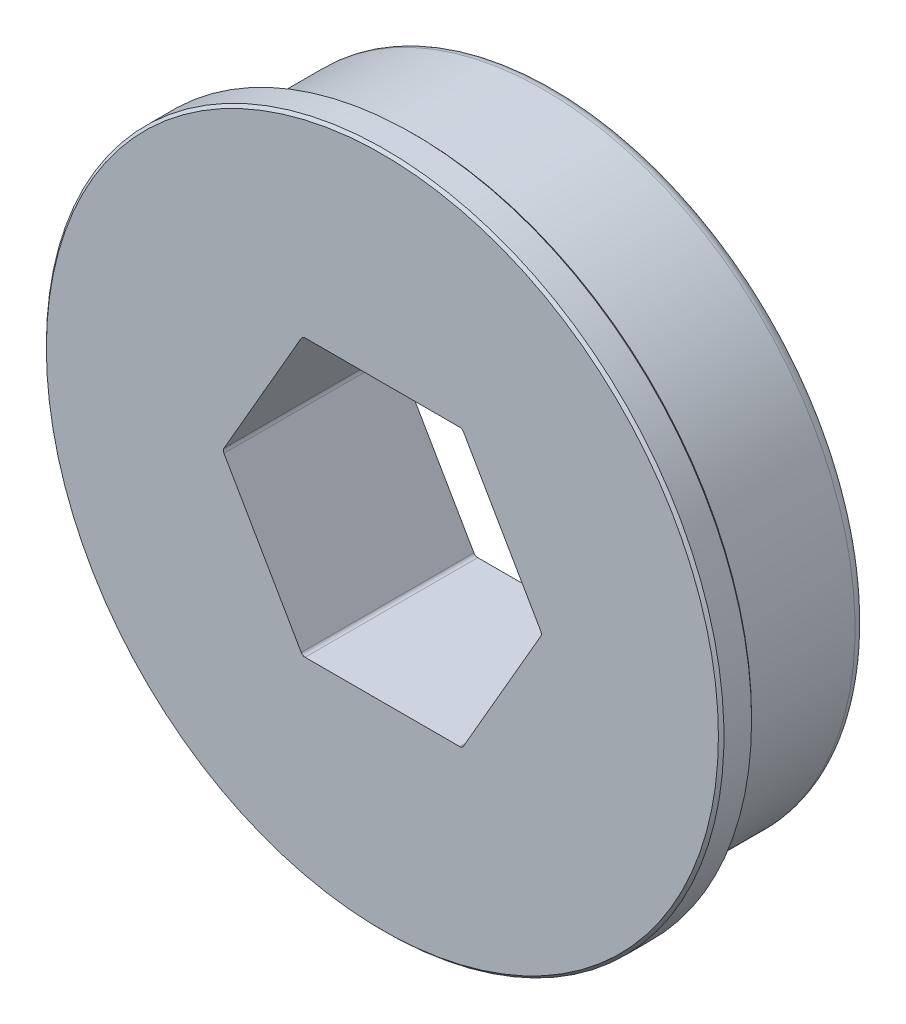
ISO-10303-21;
HEADER;
FILE_DESCRIPTION(('STEP AP214'),'2;1');
FILE_NAME('part.step','',(''),(''),'','','');
FILE_SCHEMA(('AUTOMOTIVE_DESIGN { 1 0 10303 214 1 1 1 1 }'));
ENDSEC;
DATA;
#1=APPLICATION_CONTEXT('core data for automotive mechanical design processes');
#2=APPLICATION_PROTOCOL_DEFINITION('international standard','automotive_design',2000,#1);
#3=PRODUCT_CONTEXT('',#1,'mechanical');
#4=PRODUCT('Part','Part','',(#3));
#5=PRODUCT_RELATED_PRODUCT_CATEGORY('part','',(#4));
#6=PRODUCT_DEFINITION_FORMATION('','',#4);
#7=PRODUCT_DEFINITION_CONTEXT('part definition',#1,'design');
#8=PRODUCT_DEFINITION('design','',#6,#7);
#9=PRODUCT_DEFINITION_SHAPE('','',#8);
#10=(LENGTH_UNIT() NAMED_UNIT(*) SI_UNIT(.MILLI.,.METRE.));
#11=(NAMED_UNIT(*) PLANE_ANGLE_UNIT() SI_UNIT($,.RADIAN.));
#12=(NAMED_UNIT(*) SI_UNIT($,.STERADIAN.) SOLID_ANGLE_UNIT());
#13=UNCERTAINTY_MEASURE_WITH_UNIT(LENGTH_MEASURE(1.E-05),#10,'distance_accuracy_value','');
#14=(GEOMETRIC_REPRESENTATION_CONTEXT(3) GLOBAL_UNCERTAINTY_ASSIGNED_CONTEXT((#13)) GLOBAL_UNIT_ASSIGNED_CONTEXT((#10,
#11,#12)) REPRESENTATION_CONTEXT('',''));
#15=CARTESIAN_POINT('',(0.,0.,0.));
#16=DIRECTION('',(0.,0.,1.));
#17=DIRECTION('',(1.,0.,0.));
#18=AXIS2_PLACEMENT_3D('',#15,#16,#17);
#19=CARTESIAN_POINT('',(0.,0.,7.92734));
#20=DIRECTION('',(0.,0.,-1.));
#21=DIRECTION('',(-1.,0.,0.));
#22=AXIS2_PLACEMENT_3D('',#19,#20,#21);
#23=CYLINDRICAL_SURFACE('',#22,15.5575);
#24=CARTESIAN_POINT('',(0.,0.,6.53034000000006));
#25=DIRECTION('',(0.,0.,1.));
#26=DIRECTION('',(1.,0.,0.));
#27=AXIS2_PLACEMENT_3D('',#24,#25,#26);
#28=CIRCLE('',#27,15.5575);
#29=CARTESIAN_POINT('',(-15.5575,0.,6.53034000000006));
#30=VERTEX_POINT('',#29);
#31=EDGE_CURVE('E187',#30,#30,#28,.T.);
#32=CARTESIAN_POINT('',(0.,0.,7.80033999999998));
#33=DIRECTION('',(0.,0.,1.));
#34=DIRECTION('',(1.,0.,0.));
#35=AXIS2_PLACEMENT_3D('',#32,#33,#34);
#36=CIRCLE('',#35,15.5575);
#37=CARTESIAN_POINT('',(-15.5575,0.,7.80033999999998));
#38=VERTEX_POINT('',#37);
#39=EDGE_CURVE('E178',#38,#38,#36,.F.);
#40=CARTESIAN_POINT('',(-15.5575,0.,6.53034000000006));
#41=CARTESIAN_POINT('',(-15.5575,0.,6.54356916666673));
#42=CARTESIAN_POINT('',(-15.5575,0.,6.55679833333339));
#43=CARTESIAN_POINT('',(-15.5575,0.,6.58325666666672));
#44=CARTESIAN_POINT('',(-15.5575,0.,6.59648583333339));
#45=CARTESIAN_POINT('',(-15.5575,0.,6.62294416666672));
#46=CARTESIAN_POINT('',(-15.5575,0.,6.63617333333339));
#47=CARTESIAN_POINT('',(-15.5575,0.,6.66263166666672));
#48=CARTESIAN_POINT('',(-15.5575,0.,6.67586083333339));
#49=CARTESIAN_POINT('',(-15.5575,0.,6.70231916666672));
#50=CARTESIAN_POINT('',(-15.5575,0.,6.71554833333338));
#51=CARTESIAN_POINT('',(-15.5575,0.,6.74200666666672));
#52=CARTESIAN_POINT('',(-15.5575,0.,6.75523583333338));
#53=CARTESIAN_POINT('',(-15.5575,0.,6.78169416666671));
#54=CARTESIAN_POINT('',(-15.5575,0.,6.79492333333338));
#55=CARTESIAN_POINT('',(-15.5575,0.,6.82138166666671));
#56=CARTESIAN_POINT('',(-15.5575,0.,6.83461083333338));
#57=CARTESIAN_POINT('',(-15.5575,0.,6.86106916666671));
#58=CARTESIAN_POINT('',(-15.5575,0.,6.87429833333337));
#59=CARTESIAN_POINT('',(-15.5575,0.,6.90075666666671));
#60=CARTESIAN_POINT('',(-15.5575,0.,6.91398583333337));
#61=CARTESIAN_POINT('',(-15.5575,0.,6.9404441666667));
#62=CARTESIAN_POINT('',(-15.5575,0.,6.95367333333337));
#63=CARTESIAN_POINT('',(-15.5575,0.,6.9801316666667));
#64=CARTESIAN_POINT('',(-15.5575,0.,6.99336083333337));
#65=CARTESIAN_POINT('',(-15.5575,0.,7.0198191666667));
#66=CARTESIAN_POINT('',(-15.5575,0.,7.03304833333336));
#67=CARTESIAN_POINT('',(-15.5575,0.,7.0595066666667));
#68=CARTESIAN_POINT('',(-15.5575,0.,7.07273583333336));
#69=CARTESIAN_POINT('',(-15.5575,0.,7.09919416666669));
#70=CARTESIAN_POINT('',(-15.5575,0.,7.11242333333336));
#71=CARTESIAN_POINT('',(-15.5575,0.,7.13888166666669));
#72=CARTESIAN_POINT('',(-15.5575,0.,7.15211083333336));
#73=CARTESIAN_POINT('',(-15.5575,0.,7.17856916666669));
#74=CARTESIAN_POINT('',(-15.5575,0.,7.19179833333335));
#75=CARTESIAN_POINT('',(-15.5575,0.,7.21825666666669));
#76=CARTESIAN_POINT('',(-15.5575,0.,7.23148583333335));
#77=CARTESIAN_POINT('',(-15.5575,0.,7.25794416666668));
#78=CARTESIAN_POINT('',(-15.5575,0.,7.27117333333335));
#79=CARTESIAN_POINT('',(-15.5575,0.,7.29763166666668));
#80=CARTESIAN_POINT('',(-15.5575,0.,7.31086083333335));
#81=CARTESIAN_POINT('',(-15.5575,0.,7.33731916666668));
#82=CARTESIAN_POINT('',(-15.5575,0.,7.35054833333334));
#83=CARTESIAN_POINT('',(-15.5575,0.,7.37700666666668));
#84=CARTESIAN_POINT('',(-15.5575,0.,7.39023583333334));
#85=CARTESIAN_POINT('',(-15.5575,0.,7.41669416666667));
#86=CARTESIAN_POINT('',(-15.5575,0.,7.42992333333334));
#87=CARTESIAN_POINT('',(-15.5575,0.,7.45638166666667));
#88=CARTESIAN_POINT('',(-15.5575,0.,7.46961083333334));
#89=CARTESIAN_POINT('',(-15.5575,0.,7.49606916666667));
#90=CARTESIAN_POINT('',(-15.5575,0.,7.50929833333333));
#91=CARTESIAN_POINT('',(-15.5575,0.,7.53575666666667));
#92=CARTESIAN_POINT('',(-15.5575,0.,7.54898583333333));
#93=CARTESIAN_POINT('',(-15.5575,0.,7.57544416666666));
#94=CARTESIAN_POINT('',(-15.5575,0.,7.58867333333333));
#95=CARTESIAN_POINT('',(-15.5575,0.,7.61513166666666));
#96=CARTESIAN_POINT('',(-15.5575,0.,7.62836083333333));
#97=CARTESIAN_POINT('',(-15.5575,0.,7.65481916666666));
#98=CARTESIAN_POINT('',(-15.5575,0.,7.66804833333332));
#99=CARTESIAN_POINT('',(-15.5575,0.,7.69450666666666));
#100=CARTESIAN_POINT('',(-15.5575,0.,7.70773583333332));
#101=CARTESIAN_POINT('',(-15.5575,0.,7.73419416666665));
#102=CARTESIAN_POINT('',(-15.5575,0.,7.74742333333332));
#103=CARTESIAN_POINT('',(-15.5575,0.,7.77388166666665));
#104=CARTESIAN_POINT('',(-15.5575,0.,7.78711083333332));
#105=CARTESIAN_POINT('',(-15.5575,0.,7.80033999999998));
#106=B_SPLINE_CURVE_WITH_KNOTS('',3,(#40,#41,#42,#43,#44,#45,#46,#47,#48,#49,#50,#51,#52,#53,
#54,#55,#56,#57,#58,#59,#60,#61,#62,#63,#64,#65,#66,#67,#68,#69,#70,#71,#72,#73,#74,#75,#76,#77,
#78,#79,#80,#81,#82,#83,#84,#85,#86,#87,#88,#89,#90,#91,#92,#93,#94,#95,#96,#97,#98,#99,#100,
#101,#102,#103,#104,#105),.UNSPECIFIED.,.F.,.F.,(4,2,2,2,2,2,2,2,2,2,2,2,2,2,2,2,2,2,2,2,2,2,2,
2,2,2,2,2,2,2,2,2,4),(0.,0.0396874999999972,0.0793749999999953,0.119062499999992,
0.15874999999999,0.198437499999988,0.238124999999985,0.277812499999982,0.31749999999998,
0.357187499999977,0.396874999999974,0.436562499999973,0.47624999999997,0.515937499999967,
0.555624999999965,0.595312499999962,0.634999999999959,0.674687499999957,0.714374999999955,
0.754062499999952,0.79374999999995,0.833437499999947,0.873124999999944,0.912812499999942,
0.95249999999994,0.992187499999937,1.03187499999993,1.07156249999993,1.11124999999993,
1.15093749999993,1.19062499999992,1.23031249999992,1.26999999999992),.UNSPECIFIED.);
#107=EDGE_CURVE('BSEAM34',#30,#38,#106,.T.);
#108=ORIENTED_EDGE('',*,*,#31,.T.);
#109=ORIENTED_EDGE('',*,*,#39,.T.);
#110=ORIENTED_EDGE('',*,*,#107,.T.);
#111=ORIENTED_EDGE('',*,*,#107,.F.);
#112=EDGE_LOOP('',(#108,#110,#109,#111));
#113=FACE_BOUND('',#112,.T.);
#114=ADVANCED_FACE('F34',(#113),#23,.T.);
#115=CARTESIAN_POINT('',(0.,0.,7.92734));
#116=DIRECTION('',(0.,0.,1.));
#117=DIRECTION('',(1.,0.,0.));
#118=AXIS2_PLACEMENT_3D('',#115,#116,#117);
#119=PLANE('',#118);
#120=CARTESIAN_POINT('',(0.,0.,7.92734));
#121=DIRECTION('',(0.,0.,1.));
#122=DIRECTION('',(1.,0.,0.));
#123=AXIS2_PLACEMENT_3D('',#120,#121,#122);
#124=CIRCLE('',#123,15.4305);
#125=CARTESIAN_POINT('',(15.4305,0.,7.92734));
#126=VERTEX_POINT('',#125);
#127=EDGE_CURVE('E181',#126,#126,#124,.T.);
#128=ORIENTED_EDGE('',*,*,#127,.T.);
#129=EDGE_LOOP('',(#128));
#130=FACE_BOUND('',#129,.T.);
#131=DIRECTION('',(0.5,0.866025403784439,0.));
#132=VECTOR('',#131,1.);
#133=CARTESIAN_POINT('',(3.66617420935413,-6.35000000000001,7.92734));
#134=LINE('',#133,#132);
#135=CARTESIAN_POINT('',(3.7248329967038,-6.24840000000001,7.92734));
#136=VERTEX_POINT('',#135);
#137=CARTESIAN_POINT('',(7.27368963135859,-0.101600000000005,7.92734));
#138=VERTEX_POINT('',#137);
#139=EDGE_CURVE('E152',#136,#138,#134,.T.);
#140=ORIENTED_EDGE('',*,*,#139,.F.);
#141=CARTESIAN_POINT('',(3.5488566346548,-6.14680000000001,7.92734));
#142=DIRECTION('',(0.,0.,1.));
#143=DIRECTION('',(1.,0.,0.));
#144=AXIS2_PLACEMENT_3D('',#141,#142,#143);
#145=CIRCLE('',#144,0.2032);
#146=CARTESIAN_POINT('',(3.5488566346548,-6.35000000000001,7.92734));
#147=VERTEX_POINT('',#146);
#148=EDGE_CURVE('E221',#136,#147,#145,.F.);
#149=ORIENTED_EDGE('',*,*,#148,.T.);
#150=DIRECTION('',(1.,0.,0.));
#151=VECTOR('',#150,1.);
#152=CARTESIAN_POINT('',(-3.66617420935411,-6.35000000000001,7.92734));
#153=LINE('',#152,#151);
#154=CARTESIAN_POINT('',(-3.54885663465478,-6.35000000000001,7.92734));
#155=VERTEX_POINT('',#154);
#156=EDGE_CURVE('E164',#155,#147,#153,.T.);
#157=ORIENTED_EDGE('',*,*,#156,.F.);
#158=CARTESIAN_POINT('',(-3.54885663465478,-6.14680000000001,7.92734));
#159=DIRECTION('',(0.,0.,1.));
#160=DIRECTION('',(1.,0.,0.));
#161=AXIS2_PLACEMENT_3D('',#158,#159,#160);
#162=CIRCLE('',#161,0.2032);
#163=CARTESIAN_POINT('',(-3.72483299670378,-6.2484,7.92734));
#164=VERTEX_POINT('',#163);
#165=EDGE_CURVE('E217',#155,#164,#162,.F.);
#166=ORIENTED_EDGE('',*,*,#165,.T.);
#167=DIRECTION('',(0.5,-0.866025403784438,0.));
#168=VECTOR('',#167,1.);
#169=CARTESIAN_POINT('',(-7.33234841870824,0.,7.92734));
#170=LINE('',#169,#168);
#171=CARTESIAN_POINT('',(-7.27368963135857,-0.101600000000006,7.92734));
#172=VERTEX_POINT('',#171);
#173=EDGE_CURVE('E161',#172,#164,#170,.T.);
#174=ORIENTED_EDGE('',*,*,#173,.F.);
#175=CARTESIAN_POINT('',(-7.09771326930958,0.,7.92734));
#176=DIRECTION('',(0.,0.,1.));
#177=DIRECTION('',(1.,0.,0.));
#178=AXIS2_PLACEMENT_3D('',#175,#176,#177);
#179=CIRCLE('',#178,0.2032);
#180=CARTESIAN_POINT('',(-7.27368963135858,0.101599999999993,7.92734));
#181=VERTEX_POINT('',#180);
#182=EDGE_CURVE('E225',#172,#181,#179,.F.);
#183=ORIENTED_EDGE('',*,*,#182,.T.);
#184=DIRECTION('',(-0.5,-0.866025403784439,0.));
#185=VECTOR('',#184,1.);
#186=CARTESIAN_POINT('',(-3.66617420935412,6.34999999999999,7.92734));
#187=LINE('',#186,#185);
#188=CARTESIAN_POINT('',(-3.72483299670379,6.24839999999999,7.92734));
#189=VERTEX_POINT('',#188);
#190=EDGE_CURVE('E155',#189,#181,#187,.T.);
#191=ORIENTED_EDGE('',*,*,#190,.F.);
#192=CARTESIAN_POINT('',(-3.54885663465479,6.14679999999999,7.92734));
#193=DIRECTION('',(0.,0.,1.));
#194=DIRECTION('',(1.,0.,0.));
#195=AXIS2_PLACEMENT_3D('',#192,#193,#194);
#196=CIRCLE('',#195,0.2032);
#197=CARTESIAN_POINT('',(-3.54885663465479,6.34999999999999,7.92734));
#198=VERTEX_POINT('',#197);
#199=EDGE_CURVE('E229',#189,#198,#196,.F.);
#200=ORIENTED_EDGE('',*,*,#199,.T.);
#201=DIRECTION('',(-1.,0.,0.));
#202=VECTOR('',#201,1.);
#203=CARTESIAN_POINT('',(3.66617420935413,6.35,7.92734));
#204=LINE('',#203,#202);
#205=CARTESIAN_POINT('',(3.5488566346548,6.35,7.92734));
#206=VERTEX_POINT('',#205);
#207=EDGE_CURVE('E151',#206,#198,#204,.T.);
#208=ORIENTED_EDGE('',*,*,#207,.F.);
#209=CARTESIAN_POINT('',(3.5488566346548,6.1468,7.92734));
#210=DIRECTION('',(0.,0.,1.));
#211=DIRECTION('',(1.,0.,0.));
#212=AXIS2_PLACEMENT_3D('',#209,#210,#211);
#213=CIRCLE('',#212,0.2032);
#214=CARTESIAN_POINT('',(3.7248329967038,6.24839999999999,7.92734));
#215=VERTEX_POINT('',#214);
#216=EDGE_CURVE('E150',#206,#215,#213,.F.);
#217=ORIENTED_EDGE('',*,*,#216,.T.);
#218=DIRECTION('',(-0.5,0.866025403784438,0.));
#219=VECTOR('',#218,1.);
#220=CARTESIAN_POINT('',(7.33234841870825,0.,7.92734));
#221=LINE('',#220,#219);
#222=CARTESIAN_POINT('',(7.27368963135859,0.101599999999996,7.92734));
#223=VERTEX_POINT('',#222);
#224=EDGE_CURVE('E141',#223,#215,#221,.T.);
#225=ORIENTED_EDGE('',*,*,#224,.F.);
#226=CARTESIAN_POINT('',(7.09771326930959,0.,7.92734));
#227=DIRECTION('',(0.,0.,1.));
#228=DIRECTION('',(1.,0.,0.));
#229=AXIS2_PLACEMENT_3D('',#226,#227,#228);
#230=CIRCLE('',#229,0.2032);
#231=EDGE_CURVE('E125',#223,#138,#230,.F.);
#232=ORIENTED_EDGE('',*,*,#231,.T.);
#233=EDGE_LOOP('',(#140,#149,#157,#166,#174,#183,#191,#200,#208,#217,#225,#232));
#234=FACE_BOUND('',#233,.T.);
#235=ADVANCED_FACE('F148',(#130,#234),#119,.T.);
#236=CARTESIAN_POINT('',(0.,0.,6.40334));
#237=DIRECTION('',(0.,0.,1.));
#238=DIRECTION('',(1.,0.,0.));
#239=AXIS2_PLACEMENT_3D('',#236,#237,#238);
#240=PLANE('',#239);
#241=CARTESIAN_POINT('',(0.,0.,6.40334));
#242=DIRECTION('',(0.,0.,1.));
#243=DIRECTION('',(1.,0.,0.));
#244=AXIS2_PLACEMENT_3D('',#241,#242,#243);
#245=CIRCLE('',#244,15.4304999999999);
#246=CARTESIAN_POINT('',(15.4305,0.,6.40334));
#247=VERTEX_POINT('',#246);
#248=EDGE_CURVE('E184',#247,#247,#245,.F.);
#249=ORIENTED_EDGE('',*,*,#248,.T.);
#250=EDGE_LOOP('',(#249));
#251=FACE_BOUND('',#250,.T.);
#252=CARTESIAN_POINT('',(0.,0.,6.40334));
#253=DIRECTION('',(0.,0.,-1.));
#254=DIRECTION('',(-1.,0.,0.));
#255=AXIS2_PLACEMENT_3D('',#252,#253,#254);
#256=CIRCLE('',#255,13.97);
#257=CARTESIAN_POINT('',(-13.97,0.,6.40334));
#258=VERTEX_POINT('',#257);
#259=EDGE_CURVE('E175',#258,#258,#256,.T.);
#260=ORIENTED_EDGE('',*,*,#259,.F.);
#261=EDGE_LOOP('',(#260));
#262=FACE_BOUND('',#261,.T.);
#263=ADVANCED_FACE('F252',(#251,#262),#240,.F.);
#264=CARTESIAN_POINT('',(0.,0.,5.89534));
#265=DIRECTION('',(0.,0.,1.));
#266=DIRECTION('',(1.,0.,0.));
#267=AXIS2_PLACEMENT_3D('',#264,#265,#266);
#268=CYLINDRICAL_SURFACE('',#267,13.97);
#269=CARTESIAN_POINT('',(0.,0.,5.89534));
#270=DIRECTION('',(0.,0.,-1.));
#271=DIRECTION('',(-1.,0.,0.));
#272=AXIS2_PLACEMENT_3D('',#269,#270,#271);
#273=CIRCLE('',#272,13.97);
#274=CARTESIAN_POINT('',(-13.97,0.,5.89534));
#275=VERTEX_POINT('',#274);
#276=EDGE_CURVE('E171',#275,#275,#273,.T.);
#277=ORIENTED_EDGE('',*,*,#276,.F.);
#278=EDGE_LOOP('',(#277));
#279=FACE_BOUND('',#278,.T.);
#280=ORIENTED_EDGE('',*,*,#259,.T.);
#281=EDGE_LOOP('',(#280));
#282=FACE_BOUND('',#281,.T.);
#283=ADVANCED_FACE('F345',(#279,#282),#268,.T.);
#284=CARTESIAN_POINT('',(0.,0.,0.));
#285=DIRECTION('',(0.,0.,1.));
#286=DIRECTION('',(1.,0.,0.));
#287=AXIS2_PLACEMENT_3D('',#284,#285,#286);
#288=CYLINDRICAL_SURFACE('',#287,14.2875);
#289=CARTESIAN_POINT('',(0.,0.,0.508));
#290=DIRECTION('',(0.,0.,-1.));
#291=DIRECTION('',(-1.,0.,0.));
#292=AXIS2_PLACEMENT_3D('',#289,#290,#291);
#293=CIRCLE('',#292,14.2875);
#294=CARTESIAN_POINT('',(-14.2875,0.,0.508));
#295=VERTEX_POINT('',#294);
#296=EDGE_CURVE('E42',#295,#295,#293,.F.);
#297=ORIENTED_EDGE('',*,*,#296,.T.);
#298=EDGE_LOOP('',(#297));
#299=FACE_BOUND('',#298,.T.);
#300=CARTESIAN_POINT('',(0.,0.,5.89534));
#301=DIRECTION('',(0.,0.,1.));
#302=DIRECTION('',(-1.,0.,0.));
#303=AXIS2_PLACEMENT_3D('',#300,#301,#302);
#304=CIRCLE('',#303,14.2875);
#305=CARTESIAN_POINT('',(-14.2875,0.,5.89534));
#306=VERTEX_POINT('',#305);
#307=EDGE_CURVE('E168',#306,#306,#304,.T.);
#308=ORIENTED_EDGE('',*,*,#307,.F.);
#309=EDGE_LOOP('',(#308));
#310=FACE_BOUND('',#309,.T.);
#311=ADVANCED_FACE('F234',(#299,#310),#288,.T.);
#312=CARTESIAN_POINT('',(0.,0.,0.));
#313=DIRECTION('',(0.,0.,-1.));
#314=DIRECTION('',(-1.,0.,0.));
#315=AXIS2_PLACEMENT_3D('',#312,#313,#314);
#316=PLANE('',#315);
#317=CARTESIAN_POINT('',(0.,0.,0.));
#318=DIRECTION('',(0.,0.,-1.));
#319=DIRECTION('',(-1.,0.,0.));
#320=AXIS2_PLACEMENT_3D('',#317,#318,#319);
#321=CIRCLE('',#320,13.7795);
#322=CARTESIAN_POINT('',(-13.7795,0.,0.));
#323=VERTEX_POINT('',#322);
#324=EDGE_CURVE('E11',#323,#323,#321,.T.);
#325=ORIENTED_EDGE('',*,*,#324,.T.);
#326=EDGE_LOOP('',(#325));
#327=FACE_BOUND('',#326,.T.);
#328=DIRECTION('',(1.,0.,0.));
#329=VECTOR('',#328,1.);
#330=CARTESIAN_POINT('',(-3.66617420935411,-6.35000000000001,0.));
#331=LINE('',#330,#329);
#332=CARTESIAN_POINT('',(-3.54885663465478,-6.35000000000001,0.));
#333=VERTEX_POINT('',#332);
#334=CARTESIAN_POINT('',(3.5488566346548,-6.35000000000001,0.));
#335=VERTEX_POINT('',#334);
#336=EDGE_CURVE('E172',#333,#335,#331,.T.);
#337=ORIENTED_EDGE('',*,*,#336,.T.);
#338=CARTESIAN_POINT('',(3.5488566346548,-6.14680000000001,0.));
#339=DIRECTION('',(0.,0.,-1.));
#340=DIRECTION('',(-1.,0.,0.));
#341=AXIS2_PLACEMENT_3D('',#338,#339,#340);
#342=CIRCLE('',#341,0.2032);
#343=CARTESIAN_POINT('',(3.7248329967038,-6.24840000000001,0.));
#344=VERTEX_POINT('',#343);
#345=EDGE_CURVE('E223',#335,#344,#342,.F.);
#346=ORIENTED_EDGE('',*,*,#345,.T.);
#347=DIRECTION('',(0.5,0.866025403784439,0.));
#348=VECTOR('',#347,1.);
#349=CARTESIAN_POINT('',(3.66617420935413,-6.35000000000001,0.));
#350=LINE('',#349,#348);
#351=CARTESIAN_POINT('',(7.27368963135859,-0.101600000000005,0.));
#352=VERTEX_POINT('',#351);
#353=EDGE_CURVE('E167',#344,#352,#350,.T.);
#354=ORIENTED_EDGE('',*,*,#353,.T.);
#355=CARTESIAN_POINT('',(7.09771326930959,0.,0.));
#356=DIRECTION('',(0.,0.,-1.));
#357=DIRECTION('',(-1.,0.,0.));
#358=AXIS2_PLACEMENT_3D('',#355,#356,#357);
#359=CIRCLE('',#358,0.2032);
#360=CARTESIAN_POINT('',(7.27368963135859,0.101599999999996,0.));
#361=VERTEX_POINT('',#360);
#362=EDGE_CURVE('E135',#352,#361,#359,.F.);
#363=ORIENTED_EDGE('',*,*,#362,.T.);
#364=DIRECTION('',(-0.5,0.866025403784438,0.));
#365=VECTOR('',#364,1.);
#366=CARTESIAN_POINT('',(7.33234841870825,0.,0.));
#367=LINE('',#366,#365);
#368=CARTESIAN_POINT('',(3.7248329967038,6.24839999999999,0.));
#369=VERTEX_POINT('',#368);
#370=EDGE_CURVE('E144',#361,#369,#367,.T.);
#371=ORIENTED_EDGE('',*,*,#370,.T.);
#372=CARTESIAN_POINT('',(3.5488566346548,6.1468,0.));
#373=DIRECTION('',(0.,0.,-1.));
#374=DIRECTION('',(-1.,0.,0.));
#375=AXIS2_PLACEMENT_3D('',#372,#373,#374);
#376=CIRCLE('',#375,0.2032);
#377=CARTESIAN_POINT('',(3.5488566346548,6.35,0.));
#378=VERTEX_POINT('',#377);
#379=EDGE_CURVE('E215',#369,#378,#376,.F.);
#380=ORIENTED_EDGE('',*,*,#379,.T.);
#381=DIRECTION('',(-1.,0.,0.));
#382=VECTOR('',#381,1.);
#383=CARTESIAN_POINT('',(3.66617420935413,6.35,0.));
#384=LINE('',#383,#382);
#385=CARTESIAN_POINT('',(-3.54885663465479,6.34999999999999,0.));
#386=VERTEX_POINT('',#385);
#387=EDGE_CURVE('E298',#378,#386,#384,.T.);
#388=ORIENTED_EDGE('',*,*,#387,.T.);
#389=CARTESIAN_POINT('',(-3.54885663465479,6.14679999999999,0.));
#390=DIRECTION('',(0.,0.,-1.));
#391=DIRECTION('',(-1.,0.,0.));
#392=AXIS2_PLACEMENT_3D('',#389,#390,#391);
#393=CIRCLE('',#392,0.2032);
#394=CARTESIAN_POINT('',(-3.72483299670379,6.24839999999999,0.));
#395=VERTEX_POINT('',#394);
#396=EDGE_CURVE('E56',#386,#395,#393,.F.);
#397=ORIENTED_EDGE('',*,*,#396,.T.);
#398=DIRECTION('',(-0.5,-0.866025403784439,0.));
#399=VECTOR('',#398,1.);
#400=CARTESIAN_POINT('',(-3.66617420935412,6.34999999999999,0.));
#401=LINE('',#400,#399);
#402=CARTESIAN_POINT('',(-7.27368963135858,0.101599999999993,0.));
#403=VERTEX_POINT('',#402);
#404=EDGE_CURVE('E292',#395,#403,#401,.T.);
#405=ORIENTED_EDGE('',*,*,#404,.T.);
#406=CARTESIAN_POINT('',(-7.09771326930958,0.,0.));
#407=DIRECTION('',(0.,0.,-1.));
#408=DIRECTION('',(-1.,0.,0.));
#409=AXIS2_PLACEMENT_3D('',#406,#407,#408);
#410=CIRCLE('',#409,0.2032);
#411=CARTESIAN_POINT('',(-7.27368963135857,-0.101600000000006,0.));
#412=VERTEX_POINT('',#411);
#413=EDGE_CURVE('E227',#403,#412,#410,.F.);
#414=ORIENTED_EDGE('',*,*,#413,.T.);
#415=DIRECTION('',(0.5,-0.866025403784438,0.));
#416=VECTOR('',#415,1.);
#417=CARTESIAN_POINT('',(-7.33234841870824,0.,0.));
#418=LINE('',#417,#416);
#419=CARTESIAN_POINT('',(-3.72483299670378,-6.2484,0.));
#420=VERTEX_POINT('',#419);
#421=EDGE_CURVE('E290',#412,#420,#418,.T.);
#422=ORIENTED_EDGE('',*,*,#421,.T.);
#423=CARTESIAN_POINT('',(-3.54885663465478,-6.14680000000001,0.));
#424=DIRECTION('',(0.,0.,-1.));
#425=DIRECTION('',(-1.,0.,0.));
#426=AXIS2_PLACEMENT_3D('',#423,#424,#425);
#427=CIRCLE('',#426,0.2032);
#428=EDGE_CURVE('E219',#420,#333,#427,.F.);
#429=ORIENTED_EDGE('',*,*,#428,.T.);
#430=EDGE_LOOP('',(#337,#346,#354,#363,#371,#380,#388,#397,#405,#414,#422,#429));
#431=FACE_BOUND('',#430,.T.);
#432=ADVANCED_FACE('F289',(#327,#431),#316,.T.);
#433=CARTESIAN_POINT('',(0.,0.,5.89534));
#434=DIRECTION('',(0.,0.,-1.));
#435=DIRECTION('',(-1.,0.,0.));
#436=AXIS2_PLACEMENT_3D('',#433,#434,#435);
#437=PLANE('',#436);
#438=ORIENTED_EDGE('',*,*,#276,.T.);
#439=EDGE_LOOP('',(#438));
#440=FACE_BOUND('',#439,.T.);
#441=ORIENTED_EDGE('',*,*,#307,.T.);
#442=EDGE_LOOP('',(#441));
#443=FACE_BOUND('',#442,.T.);
#444=ADVANCED_FACE('F336',(#440,#443),#437,.F.);
#445=CARTESIAN_POINT('',(3.66617420935413,-6.35000000000001,0.));
#446=DIRECTION('',(0.866025403784439,-0.5,0.));
#447=DIRECTION('',(0.5,0.866025403784439,0.));
#448=AXIS2_PLACEMENT_3D('',#445,#446,#447);
#449=PLANE('',#448);
#450=ORIENTED_EDGE('',*,*,#139,.T.);
#451=DIRECTION('',(0.,0.,1.));
#452=VECTOR('',#451,1.);
#453=CARTESIAN_POINT('',(7.27368963135859,-0.101600000000004,0.));
#454=LINE('',#453,#452);
#455=EDGE_CURVE('E130',#138,#352,#454,.F.);
#456=ORIENTED_EDGE('',*,*,#455,.T.);
#457=ORIENTED_EDGE('',*,*,#353,.F.);
#458=DIRECTION('',(0.,0.,1.));
#459=VECTOR('',#458,1.);
#460=CARTESIAN_POINT('',(3.7248329967038,-6.24840000000001,7.92734));
#461=LINE('',#460,#459);
#462=EDGE_CURVE('E145',#344,#136,#461,.T.);
#463=ORIENTED_EDGE('',*,*,#462,.T.);
#464=EDGE_LOOP('',(#450,#456,#457,#463));
#465=FACE_BOUND('',#464,.T.);
#466=ADVANCED_FACE('F308',(#465),#449,.F.);
#467=CARTESIAN_POINT('',(-3.66617420935411,-6.35000000000001,0.));
#468=DIRECTION('',(0.,-1.,0.));
#469=DIRECTION('',(1.,0.,0.));
#470=AXIS2_PLACEMENT_3D('',#467,#468,#469);
#471=PLANE('',#470);
#472=ORIENTED_EDGE('',*,*,#336,.F.);
#473=DIRECTION('',(0.,0.,1.));
#474=VECTOR('',#473,1.);
#475=CARTESIAN_POINT('',(-3.54885663465478,-6.35000000000001,7.92734));
#476=LINE('',#475,#474);
#477=EDGE_CURVE('E201',#333,#155,#476,.T.);
#478=ORIENTED_EDGE('',*,*,#477,.T.);
#479=ORIENTED_EDGE('',*,*,#156,.T.);
#480=DIRECTION('',(0.,0.,1.));
#481=VECTOR('',#480,1.);
#482=CARTESIAN_POINT('',(3.5488566346548,-6.35000000000001,0.));
#483=LINE('',#482,#481);
#484=EDGE_CURVE('E199',#147,#335,#483,.F.);
#485=ORIENTED_EDGE('',*,*,#484,.T.);
#486=EDGE_LOOP('',(#472,#478,#479,#485));
#487=FACE_BOUND('',#486,.T.);
#488=ADVANCED_FACE('F313',(#487),#471,.F.);
#489=CARTESIAN_POINT('',(-7.33234841870824,0.,0.));
#490=DIRECTION('',(-0.866025403784438,-0.5,0.));
#491=DIRECTION('',(0.5,-0.866025403784439,0.));
#492=AXIS2_PLACEMENT_3D('',#489,#490,#491);
#493=PLANE('',#492);
#494=ORIENTED_EDGE('',*,*,#173,.T.);
#495=DIRECTION('',(0.,0.,1.));
#496=VECTOR('',#495,1.);
#497=CARTESIAN_POINT('',(-3.72483299670378,-6.24840000000001,0.));
#498=LINE('',#497,#496);
#499=EDGE_CURVE('E207',#164,#420,#498,.F.);
#500=ORIENTED_EDGE('',*,*,#499,.T.);
#501=ORIENTED_EDGE('',*,*,#421,.F.);
#502=DIRECTION('',(0.,0.,1.));
#503=VECTOR('',#502,1.);
#504=CARTESIAN_POINT('',(-7.27368963135857,-0.101600000000006,7.92734));
#505=LINE('',#504,#503);
#506=EDGE_CURVE('E204',#412,#172,#505,.T.);
#507=ORIENTED_EDGE('',*,*,#506,.T.);
#508=EDGE_LOOP('',(#494,#500,#501,#507));
#509=FACE_BOUND('',#508,.T.);
#510=ADVANCED_FACE('F294',(#509),#493,.F.);
#511=CARTESIAN_POINT('',(-3.66617420935412,6.34999999999999,0.));
#512=DIRECTION('',(-0.866025403784439,0.5,0.));
#513=DIRECTION('',(-0.5,-0.866025403784439,0.));
#514=AXIS2_PLACEMENT_3D('',#511,#512,#513);
#515=PLANE('',#514);
#516=ORIENTED_EDGE('',*,*,#190,.T.);
#517=DIRECTION('',(0.,0.,1.));
#518=VECTOR('',#517,1.);
#519=CARTESIAN_POINT('',(-7.27368963135857,0.101599999999994,0.));
#520=LINE('',#519,#518);
#521=EDGE_CURVE('E49',#181,#403,#520,.F.);
#522=ORIENTED_EDGE('',*,*,#521,.T.);
#523=ORIENTED_EDGE('',*,*,#404,.F.);
#524=DIRECTION('',(0.,0.,1.));
#525=VECTOR('',#524,1.);
#526=CARTESIAN_POINT('',(-3.72483299670379,6.24839999999999,7.92734));
#527=LINE('',#526,#525);
#528=EDGE_CURVE('E209',#395,#189,#527,.T.);
#529=ORIENTED_EDGE('',*,*,#528,.T.);
#530=EDGE_LOOP('',(#516,#522,#523,#529));
#531=FACE_BOUND('',#530,.T.);
#532=ADVANCED_FACE('F316',(#531),#515,.F.);
#533=CARTESIAN_POINT('',(3.66617420935413,6.35,0.));
#534=DIRECTION('',(0.,1.,0.));
#535=DIRECTION('',(-1.,0.,0.));
#536=AXIS2_PLACEMENT_3D('',#533,#534,#535);
#537=PLANE('',#536);
#538=ORIENTED_EDGE('',*,*,#387,.F.);
#539=DIRECTION('',(0.,0.,1.));
#540=VECTOR('',#539,1.);
#541=CARTESIAN_POINT('',(3.5488566346548,6.35,7.92734));
#542=LINE('',#541,#540);
#543=EDGE_CURVE('E196',#378,#206,#542,.T.);
#544=ORIENTED_EDGE('',*,*,#543,.T.);
#545=ORIENTED_EDGE('',*,*,#207,.T.);
#546=DIRECTION('',(0.,0.,1.));
#547=VECTOR('',#546,1.);
#548=CARTESIAN_POINT('',(-3.54885663465479,6.34999999999999,0.));
#549=LINE('',#548,#547);
#550=EDGE_CURVE('E194',#198,#386,#549,.F.);
#551=ORIENTED_EDGE('',*,*,#550,.T.);
#552=EDGE_LOOP('',(#538,#544,#545,#551));
#553=FACE_BOUND('',#552,.T.);
#554=ADVANCED_FACE('F321',(#553),#537,.F.);
#555=CARTESIAN_POINT('',(7.33234841870825,0.,0.));
#556=DIRECTION('',(0.866025403784439,0.5,0.));
#557=DIRECTION('',(-0.5,0.866025403784439,0.));
#558=AXIS2_PLACEMENT_3D('',#555,#556,#557);
#559=PLANE('',#558);
#560=ORIENTED_EDGE('',*,*,#370,.F.);
#561=DIRECTION('',(0.,0.,1.));
#562=VECTOR('',#561,1.);
#563=CARTESIAN_POINT('',(7.27368963135859,0.101599999999997,7.92734));
#564=LINE('',#563,#562);
#565=EDGE_CURVE('E129',#361,#223,#564,.T.);
#566=ORIENTED_EDGE('',*,*,#565,.T.);
#567=ORIENTED_EDGE('',*,*,#224,.T.);
#568=DIRECTION('',(0.,0.,1.));
#569=VECTOR('',#568,1.);
#570=CARTESIAN_POINT('',(3.72483299670379,6.2484,0.));
#571=LINE('',#570,#569);
#572=EDGE_CURVE('E146',#215,#369,#571,.F.);
#573=ORIENTED_EDGE('',*,*,#572,.T.);
#574=EDGE_LOOP('',(#560,#566,#567,#573));
#575=FACE_BOUND('',#574,.T.);
#576=ADVANCED_FACE('F140',(#575),#559,.F.);
#577=CARTESIAN_POINT('',(0.,0.,7.80033999999998));
#578=DIRECTION('',(0.,0.,-1.));
#579=DIRECTION('',(-1.,0.,0.));
#580=AXIS2_PLACEMENT_3D('',#577,#578,#579);
#581=CONICAL_SURFACE('',#580,15.5575,0.785398163397442);
#582=ORIENTED_EDGE('',*,*,#127,.F.);
#583=EDGE_LOOP('',(#582));
#584=FACE_BOUND('',#583,.T.);
#585=ORIENTED_EDGE('',*,*,#39,.F.);
#586=EDGE_LOOP('',(#585));
#587=FACE_BOUND('',#586,.T.);
#588=ADVANCED_FACE('F258',(#584,#587),#581,.T.);
#589=CARTESIAN_POINT('',(0.,0.,6.40334));
#590=DIRECTION('',(0.,0.,1.));
#591=DIRECTION('',(1.,0.,0.));
#592=AXIS2_PLACEMENT_3D('',#589,#590,#591);
#593=CONICAL_SURFACE('',#592,15.4304999999999,0.785398163397428);
#594=ORIENTED_EDGE('',*,*,#31,.F.);
#595=EDGE_LOOP('',(#594));
#596=FACE_BOUND('',#595,.T.);
#597=ORIENTED_EDGE('',*,*,#248,.F.);
#598=EDGE_LOOP('',(#597));
#599=FACE_BOUND('',#598,.T.);
#600=ADVANCED_FACE('F261',(#596,#599),#593,.T.);
#601=CARTESIAN_POINT('',(7.09771326930959,0.,0.));
#602=DIRECTION('',(0.,0.,-1.));
#603=DIRECTION('',(-1.,0.,0.));
#604=AXIS2_PLACEMENT_3D('',#601,#602,#603);
#605=CYLINDRICAL_SURFACE('',#604,0.2032);
#606=ORIENTED_EDGE('',*,*,#362,.F.);
#607=ORIENTED_EDGE('',*,*,#455,.F.);
#608=ORIENTED_EDGE('',*,*,#231,.F.);
#609=ORIENTED_EDGE('',*,*,#565,.F.);
#610=EDGE_LOOP('',(#606,#607,#608,#609));
#611=FACE_BOUND('',#610,.T.);
#612=ADVANCED_FACE('F128',(#611),#605,.F.);
#613=CARTESIAN_POINT('',(3.5488566346548,6.1468,0.));
#614=DIRECTION('',(0.,0.,-1.));
#615=DIRECTION('',(-1.,0.,0.));
#616=AXIS2_PLACEMENT_3D('',#613,#614,#615);
#617=CYLINDRICAL_SURFACE('',#616,0.2032);
#618=ORIENTED_EDGE('',*,*,#379,.F.);
#619=ORIENTED_EDGE('',*,*,#572,.F.);
#620=ORIENTED_EDGE('',*,*,#216,.F.);
#621=ORIENTED_EDGE('',*,*,#543,.F.);
#622=EDGE_LOOP('',(#618,#619,#620,#621));
#623=FACE_BOUND('',#622,.T.);
#624=ADVANCED_FACE('F268',(#623),#617,.F.);
#625=CARTESIAN_POINT('',(-3.54885663465478,-6.14680000000001,0.));
#626=DIRECTION('',(0.,0.,-1.));
#627=DIRECTION('',(-1.,0.,0.));
#628=AXIS2_PLACEMENT_3D('',#625,#626,#627);
#629=CYLINDRICAL_SURFACE('',#628,0.2032);
#630=ORIENTED_EDGE('',*,*,#428,.F.);
#631=ORIENTED_EDGE('',*,*,#499,.F.);
#632=ORIENTED_EDGE('',*,*,#165,.F.);
#633=ORIENTED_EDGE('',*,*,#477,.F.);
#634=EDGE_LOOP('',(#630,#631,#632,#633));
#635=FACE_BOUND('',#634,.T.);
#636=ADVANCED_FACE('F271',(#635),#629,.F.);
#637=CARTESIAN_POINT('',(3.5488566346548,-6.14680000000001,0.));
#638=DIRECTION('',(0.,0.,-1.));
#639=DIRECTION('',(-1.,0.,0.));
#640=AXIS2_PLACEMENT_3D('',#637,#638,#639);
#641=CYLINDRICAL_SURFACE('',#640,0.2032);
#642=ORIENTED_EDGE('',*,*,#345,.F.);
#643=ORIENTED_EDGE('',*,*,#484,.F.);
#644=ORIENTED_EDGE('',*,*,#148,.F.);
#645=ORIENTED_EDGE('',*,*,#462,.F.);
#646=EDGE_LOOP('',(#642,#643,#644,#645));
#647=FACE_BOUND('',#646,.T.);
#648=ADVANCED_FACE('F275',(#647),#641,.F.);
#649=CARTESIAN_POINT('',(-7.09771326930958,0.,0.));
#650=DIRECTION('',(0.,0.,-1.));
#651=DIRECTION('',(-1.,0.,0.));
#652=AXIS2_PLACEMENT_3D('',#649,#650,#651);
#653=CYLINDRICAL_SURFACE('',#652,0.2032);
#654=ORIENTED_EDGE('',*,*,#413,.F.);
#655=ORIENTED_EDGE('',*,*,#521,.F.);
#656=ORIENTED_EDGE('',*,*,#182,.F.);
#657=ORIENTED_EDGE('',*,*,#506,.F.);
#658=EDGE_LOOP('',(#654,#655,#656,#657));
#659=FACE_BOUND('',#658,.T.);
#660=ADVANCED_FACE('F243',(#659),#653,.F.);
#661=CARTESIAN_POINT('',(-3.54885663465479,6.14679999999999,0.));
#662=DIRECTION('',(0.,0.,-1.));
#663=DIRECTION('',(-1.,0.,0.));
#664=AXIS2_PLACEMENT_3D('',#661,#662,#663);
#665=CYLINDRICAL_SURFACE('',#664,0.2032);
#666=ORIENTED_EDGE('',*,*,#396,.F.);
#667=ORIENTED_EDGE('',*,*,#550,.F.);
#668=ORIENTED_EDGE('',*,*,#199,.F.);
#669=ORIENTED_EDGE('',*,*,#528,.F.);
#670=EDGE_LOOP('',(#666,#667,#668,#669));
#671=FACE_BOUND('',#670,.T.);
#672=ADVANCED_FACE('F238',(#671),#665,.F.);
#673=CARTESIAN_POINT('',(0.,0.,0.508));
#674=DIRECTION('',(0.,0.,-1.));
#675=DIRECTION('',(-1.,0.,0.));
#676=AXIS2_PLACEMENT_3D('',#673,#674,#675);
#677=TOROIDAL_SURFACE('',#676,13.7795,0.508);
#678=ORIENTED_EDGE('',*,*,#324,.F.);
#679=EDGE_LOOP('',(#678));
#680=FACE_BOUND('',#679,.T.);
#681=ORIENTED_EDGE('',*,*,#296,.F.);
#682=EDGE_LOOP('',(#681));
#683=FACE_BOUND('',#682,.T.);
#684=ADVANCED_FACE('F36',(#680,#683),#677,.T.);
#685=CLOSED_SHELL('',(#114,#235,#263,#283,#311,#432,#444,#466,#488,#510,#532,#554,#576,#588,
#600,#612,#624,#636,#648,#660,#672,#684));
#686=MANIFOLD_SOLID_BREP('B2',#685);
#687=ADVANCED_BREP_SHAPE_REPRESENTATION('',(#18,#686),#14);
#688=SHAPE_DEFINITION_REPRESENTATION(#9,#687);
ENDSEC;
END-ISO-10303-21;
